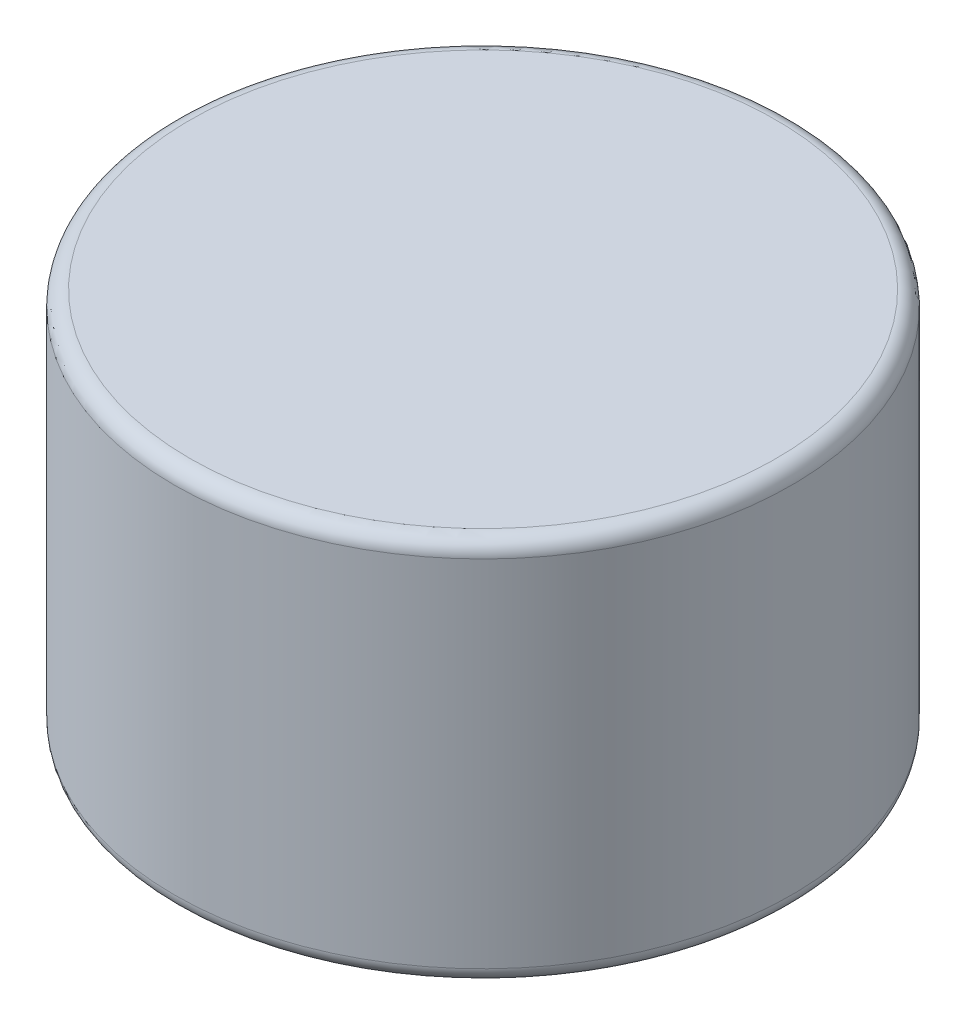
ISO-10303-21;
HEADER;
FILE_DESCRIPTION(('STEP AP214'),'2;1');
FILE_NAME('part.step','',(''),(''),'','','');
FILE_SCHEMA(('AUTOMOTIVE_DESIGN { 1 0 10303 214 1 1 1 1 }'));
ENDSEC;
DATA;
#1=APPLICATION_CONTEXT('core data for automotive mechanical design processes');
#2=APPLICATION_PROTOCOL_DEFINITION('international standard','automotive_design',2000,#1);
#3=PRODUCT_CONTEXT('',#1,'mechanical');
#4=PRODUCT('Part','Part','',(#3));
#5=PRODUCT_RELATED_PRODUCT_CATEGORY('part','',(#4));
#6=PRODUCT_DEFINITION_FORMATION('','',#4);
#7=PRODUCT_DEFINITION_CONTEXT('part definition',#1,'design');
#8=PRODUCT_DEFINITION('design','',#6,#7);
#9=PRODUCT_DEFINITION_SHAPE('','',#8);
#10=(LENGTH_UNIT() NAMED_UNIT(*) SI_UNIT(.MILLI.,.METRE.));
#11=(NAMED_UNIT(*) PLANE_ANGLE_UNIT() SI_UNIT($,.RADIAN.));
#12=(NAMED_UNIT(*) SI_UNIT($,.STERADIAN.) SOLID_ANGLE_UNIT());
#13=UNCERTAINTY_MEASURE_WITH_UNIT(LENGTH_MEASURE(1.E-05),#10,'distance_accuracy_value','');
#14=(GEOMETRIC_REPRESENTATION_CONTEXT(3) GLOBAL_UNCERTAINTY_ASSIGNED_CONTEXT((#13)) GLOBAL_UNIT_ASSIGNED_CONTEXT((#10,
#11,#12)) REPRESENTATION_CONTEXT('',''));
#15=CARTESIAN_POINT('',(0.,0.,0.));
#16=DIRECTION('',(0.,0.,1.));
#17=DIRECTION('',(1.,0.,0.));
#18=AXIS2_PLACEMENT_3D('',#15,#16,#17);
#19=CARTESIAN_POINT('',(0.,5.,0.));
#20=DIRECTION('',(0.,-1.,0.));
#21=DIRECTION('',(0.,0.,-1.));
#22=AXIS2_PLACEMENT_3D('',#19,#20,#21);
#23=CYLINDRICAL_SURFACE('',#22,4.);
#24=CARTESIAN_POINT('',(0.,0.2,0.));
#25=DIRECTION('',(0.,1.,0.));
#26=DIRECTION('',(0.,0.,1.));
#27=AXIS2_PLACEMENT_3D('',#24,#25,#26);
#28=CIRCLE('',#27,4.);
#29=CARTESIAN_POINT('',(0.,0.2,4.));
#30=VERTEX_POINT('',#29);
#31=EDGE_CURVE('E44',#30,#30,#28,.T.);
#32=ORIENTED_EDGE('',*,*,#31,.T.);
#33=EDGE_LOOP('',(#32));
#34=FACE_BOUND('',#33,.T.);
#35=CARTESIAN_POINT('',(0.,4.8,0.));
#36=DIRECTION('',(0.,1.,0.));
#37=DIRECTION('',(0.,0.,1.));
#38=AXIS2_PLACEMENT_3D('',#35,#36,#37);
#39=CIRCLE('',#38,4.);
#40=CARTESIAN_POINT('',(0.,4.8,4.));
#41=VERTEX_POINT('',#40);
#42=EDGE_CURVE('E48',#41,#41,#39,.F.);
#43=ORIENTED_EDGE('',*,*,#42,.T.);
#44=EDGE_LOOP('',(#43));
#45=FACE_BOUND('',#44,.T.);
#46=ADVANCED_FACE('F33',(#34,#45),#23,.T.);
#47=CARTESIAN_POINT('',(0.,5.,0.));
#48=DIRECTION('',(0.,1.,0.));
#49=DIRECTION('',(0.,0.,1.));
#50=AXIS2_PLACEMENT_3D('',#47,#48,#49);
#51=PLANE('',#50);
#52=CARTESIAN_POINT('',(0.,5.,0.));
#53=DIRECTION('',(0.,1.,0.));
#54=DIRECTION('',(0.,0.,1.));
#55=AXIS2_PLACEMENT_3D('',#52,#53,#54);
#56=CIRCLE('',#55,3.8);
#57=CARTESIAN_POINT('',(0.,5.,3.8));
#58=VERTEX_POINT('',#57);
#59=EDGE_CURVE('E10',#58,#58,#56,.T.);
#60=ORIENTED_EDGE('',*,*,#59,.T.);
#61=EDGE_LOOP('',(#60));
#62=FACE_BOUND('',#61,.T.);
#63=ADVANCED_FACE('F64',(#62),#51,.T.);
#64=CARTESIAN_POINT('',(0.,0.,0.));
#65=DIRECTION('',(0.,1.,0.));
#66=DIRECTION('',(0.,0.,1.));
#67=AXIS2_PLACEMENT_3D('',#64,#65,#66);
#68=PLANE('',#67);
#69=CARTESIAN_POINT('',(0.,0.,0.));
#70=DIRECTION('',(0.,1.,0.));
#71=DIRECTION('',(0.,0.,1.));
#72=AXIS2_PLACEMENT_3D('',#69,#70,#71);
#73=CIRCLE('',#72,3.8);
#74=CARTESIAN_POINT('',(0.,0.,3.8));
#75=VERTEX_POINT('',#74);
#76=EDGE_CURVE('E40',#75,#75,#73,.F.);
#77=ORIENTED_EDGE('',*,*,#76,.T.);
#78=EDGE_LOOP('',(#77));
#79=FACE_BOUND('',#78,.T.);
#80=ADVANCED_FACE('F61',(#79),#68,.F.);
#81=CARTESIAN_POINT('',(0.,0.2,0.));
#82=DIRECTION('',(0.,1.,0.));
#83=DIRECTION('',(0.,0.,1.));
#84=AXIS2_PLACEMENT_3D('',#81,#82,#83);
#85=TOROIDAL_SURFACE('',#84,3.8,0.2);
#86=ORIENTED_EDGE('',*,*,#76,.F.);
#87=EDGE_LOOP('',(#86));
#88=FACE_BOUND('',#87,.T.);
#89=ORIENTED_EDGE('',*,*,#31,.F.);
#90=EDGE_LOOP('',(#89));
#91=FACE_BOUND('',#90,.T.);
#92=ADVANCED_FACE('F57',(#88,#91),#85,.T.);
#93=CARTESIAN_POINT('',(0.,4.8,0.));
#94=DIRECTION('',(0.,1.,0.));
#95=DIRECTION('',(0.,0.,1.));
#96=AXIS2_PLACEMENT_3D('',#93,#94,#95);
#97=TOROIDAL_SURFACE('',#96,3.8,0.2);
#98=ORIENTED_EDGE('',*,*,#42,.F.);
#99=EDGE_LOOP('',(#98));
#100=FACE_BOUND('',#99,.T.);
#101=ORIENTED_EDGE('',*,*,#59,.F.);
#102=EDGE_LOOP('',(#101));
#103=FACE_BOUND('',#102,.T.);
#104=ADVANCED_FACE('F35',(#100,#103),#97,.T.);
#105=CLOSED_SHELL('',(#46,#63,#80,#92,#104));
#106=MANIFOLD_SOLID_BREP('B2',#105);
#107=ADVANCED_BREP_SHAPE_REPRESENTATION('',(#18,#106),#14);
#108=SHAPE_DEFINITION_REPRESENTATION(#9,#107);
ENDSEC;
END-ISO-10303-21;
